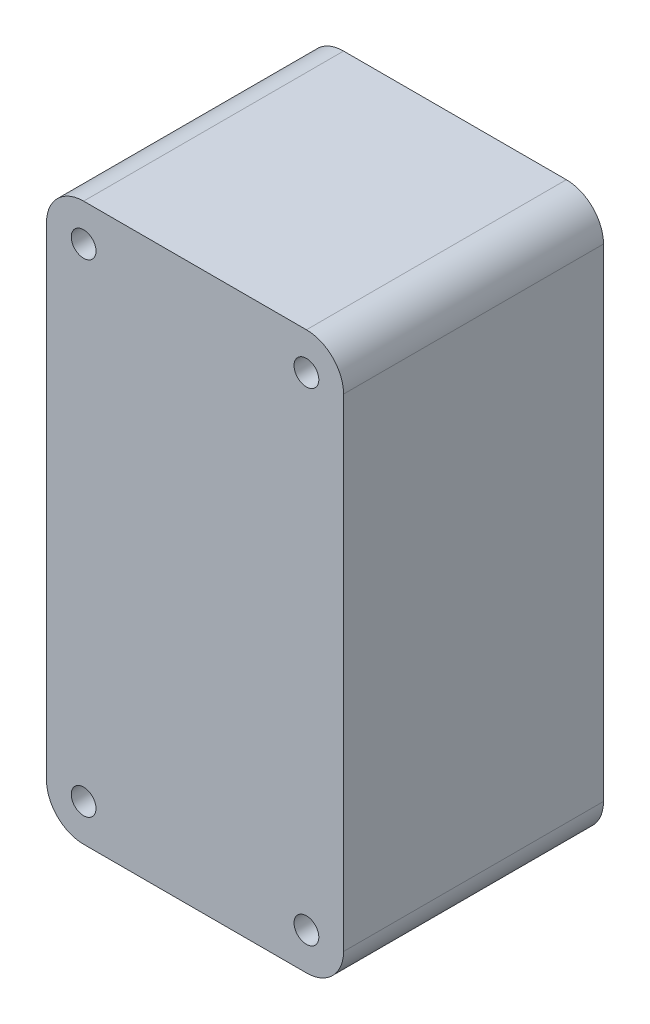
ISO-10303-21;
HEADER;
FILE_DESCRIPTION(('STEP AP214'),'2;1');
FILE_NAME('part.step','',(''),(''),'','','');
FILE_SCHEMA(('AUTOMOTIVE_DESIGN { 1 0 10303 214 1 1 1 1 }'));
ENDSEC;
DATA;
#1=APPLICATION_CONTEXT('core data for automotive mechanical design processes');
#2=APPLICATION_PROTOCOL_DEFINITION('international standard','automotive_design',2000,#1);
#3=PRODUCT_CONTEXT('',#1,'mechanical');
#4=PRODUCT('Part','Part','',(#3));
#5=PRODUCT_RELATED_PRODUCT_CATEGORY('part','',(#4));
#6=PRODUCT_DEFINITION_FORMATION('','',#4);
#7=PRODUCT_DEFINITION_CONTEXT('part definition',#1,'design');
#8=PRODUCT_DEFINITION('design','',#6,#7);
#9=PRODUCT_DEFINITION_SHAPE('','',#8);
#10=(LENGTH_UNIT() NAMED_UNIT(*) SI_UNIT(.MILLI.,.METRE.));
#11=(NAMED_UNIT(*) PLANE_ANGLE_UNIT() SI_UNIT($,.RADIAN.));
#12=(NAMED_UNIT(*) SI_UNIT($,.STERADIAN.) SOLID_ANGLE_UNIT());
#13=UNCERTAINTY_MEASURE_WITH_UNIT(LENGTH_MEASURE(1.E-05),#10,'distance_accuracy_value','');
#14=(GEOMETRIC_REPRESENTATION_CONTEXT(3) GLOBAL_UNCERTAINTY_ASSIGNED_CONTEXT((#13)) GLOBAL_UNIT_ASSIGNED_CONTEXT((#10,
#11,#12)) REPRESENTATION_CONTEXT('',''));
#15=CARTESIAN_POINT('',(0.,0.,0.));
#16=DIRECTION('',(0.,0.,1.));
#17=DIRECTION('',(1.,0.,0.));
#18=AXIS2_PLACEMENT_3D('',#15,#16,#17);
#19=CARTESIAN_POINT('',(-28.4193325347725,1.99595202398802,21.));
#20=DIRECTION('',(0.,0.,-1.));
#21=DIRECTION('',(-1.,0.,0.));
#22=AXIS2_PLACEMENT_3D('',#19,#20,#21);
#23=CYLINDRICAL_SURFACE('',#22,3.);
#24=CARTESIAN_POINT('',(-28.4193325347725,1.99595202398802,0.));
#25=DIRECTION('',(0.,0.,1.));
#26=DIRECTION('',(1.,0.,0.));
#27=AXIS2_PLACEMENT_3D('',#24,#25,#26);
#28=CIRCLE('',#27,3.);
#29=CARTESIAN_POINT('',(-28.4193325347725,4.99595202398802,0.));
#30=VERTEX_POINT('',#29);
#31=CARTESIAN_POINT('',(-31.4193325347725,1.995952023988,0.));
#32=VERTEX_POINT('',#31);
#33=EDGE_CURVE('E129',#30,#32,#28,.T.);
#34=ORIENTED_EDGE('',*,*,#33,.T.);
#35=DIRECTION('',(0.,0.,-1.));
#36=VECTOR('',#35,1.);
#37=CARTESIAN_POINT('',(-31.4193325347725,1.995952023988,21.));
#38=LINE('',#37,#36);
#39=CARTESIAN_POINT('',(-31.4193325347725,1.995952023988,21.));
#40=VERTEX_POINT('',#39);
#41=EDGE_CURVE('E11',#40,#32,#38,.T.);
#42=ORIENTED_EDGE('',*,*,#41,.F.);
#43=CARTESIAN_POINT('',(-28.4193325347725,1.99595202398802,21.));
#44=DIRECTION('',(0.,0.,1.));
#45=DIRECTION('',(1.,0.,0.));
#46=AXIS2_PLACEMENT_3D('',#43,#44,#45);
#47=CIRCLE('',#46,3.);
#48=CARTESIAN_POINT('',(-28.4193325347725,4.99595202398802,21.));
#49=VERTEX_POINT('',#48);
#50=EDGE_CURVE('E144',#49,#40,#47,.T.);
#51=ORIENTED_EDGE('',*,*,#50,.F.);
#52=DIRECTION('',(0.,0.,-1.));
#53=VECTOR('',#52,1.);
#54=CARTESIAN_POINT('',(-28.4193325347725,4.99595202398802,21.));
#55=LINE('',#54,#53);
#56=EDGE_CURVE('E125',#49,#30,#55,.T.);
#57=ORIENTED_EDGE('',*,*,#56,.T.);
#58=EDGE_LOOP('',(#34,#42,#51,#57));
#59=FACE_BOUND('',#58,.T.);
#60=ADVANCED_FACE('F33',(#59),#23,.T.);
#61=CARTESIAN_POINT('',(-31.4193325347725,1.995952023988,21.));
#62=DIRECTION('',(1.,0.,0.));
#63=DIRECTION('',(0.,1.,0.));
#64=AXIS2_PLACEMENT_3D('',#61,#62,#63);
#65=PLANE('',#64);
#66=DIRECTION('',(0.,-1.,0.));
#67=VECTOR('',#66,1.);
#68=CARTESIAN_POINT('',(-31.4193325347725,1.995952023988,0.));
#69=LINE('',#68,#67);
#70=CARTESIAN_POINT('',(-31.4193325347725,-37.004047976012,0.));
#71=VERTEX_POINT('',#70);
#72=EDGE_CURVE('E132',#32,#71,#69,.T.);
#73=ORIENTED_EDGE('',*,*,#72,.T.);
#74=DIRECTION('',(0.,0.,-1.));
#75=VECTOR('',#74,1.);
#76=CARTESIAN_POINT('',(-31.4193325347725,-37.004047976012,21.));
#77=LINE('',#76,#75);
#78=CARTESIAN_POINT('',(-31.4193325347725,-37.004047976012,21.));
#79=VERTEX_POINT('',#78);
#80=EDGE_CURVE('E41',#79,#71,#77,.T.);
#81=ORIENTED_EDGE('',*,*,#80,.F.);
#82=DIRECTION('',(0.,-1.,0.));
#83=VECTOR('',#82,1.);
#84=CARTESIAN_POINT('',(-31.4193325347725,1.995952023988,21.));
#85=LINE('',#84,#83);
#86=EDGE_CURVE('E92',#40,#79,#85,.T.);
#87=ORIENTED_EDGE('',*,*,#86,.F.);
#88=ORIENTED_EDGE('',*,*,#41,.T.);
#89=EDGE_LOOP('',(#73,#81,#87,#88));
#90=FACE_BOUND('',#89,.T.);
#91=ADVANCED_FACE('F235',(#90),#65,.F.);
#92=CARTESIAN_POINT('',(-28.4193325347725,-37.004047976012,21.));
#93=DIRECTION('',(0.,0.,-1.));
#94=DIRECTION('',(-1.,0.,0.));
#95=AXIS2_PLACEMENT_3D('',#92,#93,#94);
#96=CYLINDRICAL_SURFACE('',#95,3.);
#97=CARTESIAN_POINT('',(-28.4193325347725,-37.004047976012,0.));
#98=DIRECTION('',(0.,0.,1.));
#99=DIRECTION('',(1.,0.,0.));
#100=AXIS2_PLACEMENT_3D('',#97,#98,#99);
#101=CIRCLE('',#100,3.);
#102=CARTESIAN_POINT('',(-28.4193325347725,-40.004047976012,0.));
#103=VERTEX_POINT('',#102);
#104=EDGE_CURVE('E135',#71,#103,#101,.T.);
#105=ORIENTED_EDGE('',*,*,#104,.T.);
#106=DIRECTION('',(0.,0.,-1.));
#107=VECTOR('',#106,1.);
#108=CARTESIAN_POINT('',(-28.4193325347725,-40.004047976012,21.));
#109=LINE('',#108,#107);
#110=CARTESIAN_POINT('',(-28.4193325347725,-40.004047976012,21.));
#111=VERTEX_POINT('',#110);
#112=EDGE_CURVE('E151',#111,#103,#109,.T.);
#113=ORIENTED_EDGE('',*,*,#112,.F.);
#114=CARTESIAN_POINT('',(-28.4193325347725,-37.004047976012,21.));
#115=DIRECTION('',(0.,0.,1.));
#116=DIRECTION('',(1.,0.,0.));
#117=AXIS2_PLACEMENT_3D('',#114,#115,#116);
#118=CIRCLE('',#117,3.);
#119=EDGE_CURVE('E159',#79,#111,#118,.T.);
#120=ORIENTED_EDGE('',*,*,#119,.F.);
#121=ORIENTED_EDGE('',*,*,#80,.T.);
#122=EDGE_LOOP('',(#105,#113,#120,#121));
#123=FACE_BOUND('',#122,.T.);
#124=ADVANCED_FACE('F157',(#123),#96,.T.);
#125=CARTESIAN_POINT('',(-28.4193325347725,-40.004047976012,21.));
#126=DIRECTION('',(0.,1.,0.));
#127=DIRECTION('',(0.,0.,1.));
#128=AXIS2_PLACEMENT_3D('',#125,#126,#127);
#129=PLANE('',#128);
#130=DIRECTION('',(1.,0.,0.));
#131=VECTOR('',#130,1.);
#132=CARTESIAN_POINT('',(-28.4193325347725,-40.004047976012,0.));
#133=LINE('',#132,#131);
#134=CARTESIAN_POINT('',(-10.4193325347725,-40.004047976012,0.));
#135=VERTEX_POINT('',#134);
#136=EDGE_CURVE('E137',#103,#135,#133,.T.);
#137=ORIENTED_EDGE('',*,*,#136,.T.);
#138=DIRECTION('',(0.,0.,-1.));
#139=VECTOR('',#138,1.);
#140=CARTESIAN_POINT('',(-10.4193325347725,-40.004047976012,21.));
#141=LINE('',#140,#139);
#142=CARTESIAN_POINT('',(-10.4193325347725,-40.004047976012,21.));
#143=VERTEX_POINT('',#142);
#144=EDGE_CURVE('E148',#143,#135,#141,.T.);
#145=ORIENTED_EDGE('',*,*,#144,.F.);
#146=DIRECTION('',(1.,0.,0.));
#147=VECTOR('',#146,1.);
#148=CARTESIAN_POINT('',(-28.4193325347725,-40.004047976012,21.));
#149=LINE('',#148,#147);
#150=EDGE_CURVE('E171',#111,#143,#149,.T.);
#151=ORIENTED_EDGE('',*,*,#150,.F.);
#152=ORIENTED_EDGE('',*,*,#112,.T.);
#153=EDGE_LOOP('',(#137,#145,#151,#152));
#154=FACE_BOUND('',#153,.T.);
#155=ADVANCED_FACE('F167',(#154),#129,.F.);
#156=CARTESIAN_POINT('',(-10.4193325347725,-37.004047976012,21.));
#157=DIRECTION('',(0.,0.,-1.));
#158=DIRECTION('',(-1.,0.,0.));
#159=AXIS2_PLACEMENT_3D('',#156,#157,#158);
#160=CYLINDRICAL_SURFACE('',#159,3.);
#161=CARTESIAN_POINT('',(-10.4193325347725,-37.004047976012,0.));
#162=DIRECTION('',(0.,0.,1.));
#163=DIRECTION('',(-1.,0.,0.));
#164=AXIS2_PLACEMENT_3D('',#161,#162,#163);
#165=CIRCLE('',#164,3.);
#166=CARTESIAN_POINT('',(-7.41933253477248,-37.004047976012,0.));
#167=VERTEX_POINT('',#166);
#168=EDGE_CURVE('E139',#135,#167,#165,.T.);
#169=ORIENTED_EDGE('',*,*,#168,.T.);
#170=DIRECTION('',(0.,0.,-1.));
#171=VECTOR('',#170,1.);
#172=CARTESIAN_POINT('',(-7.41933253477248,-37.004047976012,21.));
#173=LINE('',#172,#171);
#174=CARTESIAN_POINT('',(-7.41933253477248,-37.004047976012,21.));
#175=VERTEX_POINT('',#174);
#176=EDGE_CURVE('E120',#175,#167,#173,.T.);
#177=ORIENTED_EDGE('',*,*,#176,.F.);
#178=CARTESIAN_POINT('',(-10.4193325347725,-37.004047976012,21.));
#179=DIRECTION('',(0.,0.,1.));
#180=DIRECTION('',(-1.,0.,0.));
#181=AXIS2_PLACEMENT_3D('',#178,#179,#180);
#182=CIRCLE('',#181,3.);
#183=EDGE_CURVE('E111',#143,#175,#182,.T.);
#184=ORIENTED_EDGE('',*,*,#183,.F.);
#185=ORIENTED_EDGE('',*,*,#144,.T.);
#186=EDGE_LOOP('',(#169,#177,#184,#185));
#187=FACE_BOUND('',#186,.T.);
#188=ADVANCED_FACE('F170',(#187),#160,.T.);
#189=CARTESIAN_POINT('',(-7.41933253477248,1.995952023988,21.));
#190=DIRECTION('',(-1.,0.,0.));
#191=DIRECTION('',(0.,-1.,0.));
#192=AXIS2_PLACEMENT_3D('',#189,#190,#191);
#193=PLANE('',#192);
#194=DIRECTION('',(0.,1.,0.));
#195=VECTOR('',#194,1.);
#196=CARTESIAN_POINT('',(-7.41933253477248,1.995952023988,0.));
#197=LINE('',#196,#195);
#198=CARTESIAN_POINT('',(-7.41933253477248,1.995952023988,0.));
#199=VERTEX_POINT('',#198);
#200=EDGE_CURVE('E119',#167,#199,#197,.T.);
#201=ORIENTED_EDGE('',*,*,#200,.T.);
#202=DIRECTION('',(0.,0.,-1.));
#203=VECTOR('',#202,1.);
#204=CARTESIAN_POINT('',(-7.41933253477248,1.995952023988,21.));
#205=LINE('',#204,#203);
#206=CARTESIAN_POINT('',(-7.41933253477248,1.995952023988,21.));
#207=VERTEX_POINT('',#206);
#208=EDGE_CURVE('E116',#207,#199,#205,.T.);
#209=ORIENTED_EDGE('',*,*,#208,.F.);
#210=DIRECTION('',(0.,1.,0.));
#211=VECTOR('',#210,1.);
#212=CARTESIAN_POINT('',(-7.41933253477248,1.995952023988,21.));
#213=LINE('',#212,#211);
#214=EDGE_CURVE('E105',#175,#207,#213,.T.);
#215=ORIENTED_EDGE('',*,*,#214,.F.);
#216=ORIENTED_EDGE('',*,*,#176,.T.);
#217=EDGE_LOOP('',(#201,#209,#215,#216));
#218=FACE_BOUND('',#217,.T.);
#219=ADVANCED_FACE('F117',(#218),#193,.F.);
#220=CARTESIAN_POINT('',(-10.4193325347725,1.99595202398802,21.));
#221=DIRECTION('',(0.,0.,-1.));
#222=DIRECTION('',(-1.,0.,0.));
#223=AXIS2_PLACEMENT_3D('',#220,#221,#222);
#224=CYLINDRICAL_SURFACE('',#223,3.);
#225=CARTESIAN_POINT('',(-10.4193325347725,1.99595202398802,0.));
#226=DIRECTION('',(0.,0.,1.));
#227=DIRECTION('',(1.,0.,0.));
#228=AXIS2_PLACEMENT_3D('',#225,#226,#227);
#229=CIRCLE('',#228,3.);
#230=CARTESIAN_POINT('',(-10.4193325347725,4.99595202398802,0.));
#231=VERTEX_POINT('',#230);
#232=EDGE_CURVE('E78',#199,#231,#229,.T.);
#233=ORIENTED_EDGE('',*,*,#232,.T.);
#234=DIRECTION('',(0.,0.,-1.));
#235=VECTOR('',#234,1.);
#236=CARTESIAN_POINT('',(-10.4193325347725,4.99595202398802,21.));
#237=LINE('',#236,#235);
#238=CARTESIAN_POINT('',(-10.4193325347725,4.99595202398802,21.));
#239=VERTEX_POINT('',#238);
#240=EDGE_CURVE('E121',#239,#231,#237,.T.);
#241=ORIENTED_EDGE('',*,*,#240,.F.);
#242=CARTESIAN_POINT('',(-10.4193325347725,1.99595202398802,21.));
#243=DIRECTION('',(0.,0.,1.));
#244=DIRECTION('',(1.,0.,0.));
#245=AXIS2_PLACEMENT_3D('',#242,#243,#244);
#246=CIRCLE('',#245,3.);
#247=EDGE_CURVE('E109',#207,#239,#246,.T.);
#248=ORIENTED_EDGE('',*,*,#247,.F.);
#249=ORIENTED_EDGE('',*,*,#208,.T.);
#250=EDGE_LOOP('',(#233,#241,#248,#249));
#251=FACE_BOUND('',#250,.T.);
#252=ADVANCED_FACE('F123',(#251),#224,.T.);
#253=CARTESIAN_POINT('',(-28.4193325347725,4.99595202398802,21.));
#254=DIRECTION('',(0.,-1.,0.));
#255=DIRECTION('',(0.,0.,-1.));
#256=AXIS2_PLACEMENT_3D('',#253,#254,#255);
#257=PLANE('',#256);
#258=DIRECTION('',(-1.,0.,0.));
#259=VECTOR('',#258,1.);
#260=CARTESIAN_POINT('',(-28.4193325347725,4.99595202398802,0.));
#261=LINE('',#260,#259);
#262=EDGE_CURVE('E84',#231,#30,#261,.T.);
#263=ORIENTED_EDGE('',*,*,#262,.T.);
#264=ORIENTED_EDGE('',*,*,#56,.F.);
#265=DIRECTION('',(-1.,0.,0.));
#266=VECTOR('',#265,1.);
#267=CARTESIAN_POINT('',(-28.4193325347725,4.99595202398802,21.));
#268=LINE('',#267,#266);
#269=EDGE_CURVE('E49',#239,#49,#268,.T.);
#270=ORIENTED_EDGE('',*,*,#269,.F.);
#271=ORIENTED_EDGE('',*,*,#240,.T.);
#272=EDGE_LOOP('',(#263,#264,#270,#271));
#273=FACE_BOUND('',#272,.T.);
#274=ADVANCED_FACE('F212',(#273),#257,.F.);
#275=CARTESIAN_POINT('',(-28.4193325347725,1.99595202398802,21.));
#276=DIRECTION('',(0.,0.,1.));
#277=DIRECTION('',(1.,0.,0.));
#278=AXIS2_PLACEMENT_3D('',#275,#276,#277);
#279=PLANE('',#278);
#280=CARTESIAN_POINT('',(-10.4193325347725,1.99595202398802,21.));
#281=DIRECTION('',(0.,0.,1.));
#282=DIRECTION('',(1.,0.,0.));
#283=AXIS2_PLACEMENT_3D('',#280,#281,#282);
#284=CIRCLE('',#283,1.);
#285=CARTESIAN_POINT('',(-9.41933253477248,1.99595202398802,21.));
#286=VERTEX_POINT('',#285);
#287=EDGE_CURVE('E195',#286,#286,#284,.T.);
#288=ORIENTED_EDGE('',*,*,#287,.F.);
#289=EDGE_LOOP('',(#288));
#290=FACE_BOUND('',#289,.T.);
#291=CARTESIAN_POINT('',(-28.4193325347725,1.99595202398802,21.));
#292=DIRECTION('',(0.,0.,1.));
#293=DIRECTION('',(1.,0.,0.));
#294=AXIS2_PLACEMENT_3D('',#291,#292,#293);
#295=CIRCLE('',#294,1.);
#296=CARTESIAN_POINT('',(-27.4193325347725,1.99595202398802,21.));
#297=VERTEX_POINT('',#296);
#298=EDGE_CURVE('E189',#297,#297,#295,.T.);
#299=ORIENTED_EDGE('',*,*,#298,.F.);
#300=EDGE_LOOP('',(#299));
#301=FACE_BOUND('',#300,.T.);
#302=CARTESIAN_POINT('',(-10.4193325347725,-37.004047976012,21.));
#303=DIRECTION('',(0.,0.,1.));
#304=DIRECTION('',(1.,0.,0.));
#305=AXIS2_PLACEMENT_3D('',#302,#303,#304);
#306=CIRCLE('',#305,1.);
#307=CARTESIAN_POINT('',(-9.41933253477248,-37.004047976012,21.));
#308=VERTEX_POINT('',#307);
#309=EDGE_CURVE('E183',#308,#308,#306,.T.);
#310=ORIENTED_EDGE('',*,*,#309,.F.);
#311=EDGE_LOOP('',(#310));
#312=FACE_BOUND('',#311,.T.);
#313=CARTESIAN_POINT('',(-28.4193325347725,-37.004047976012,21.));
#314=DIRECTION('',(0.,0.,1.));
#315=DIRECTION('',(1.,0.,0.));
#316=AXIS2_PLACEMENT_3D('',#313,#314,#315);
#317=CIRCLE('',#316,1.);
#318=CARTESIAN_POINT('',(-27.4193325347725,-37.004047976012,21.));
#319=VERTEX_POINT('',#318);
#320=EDGE_CURVE('E177',#319,#319,#317,.T.);
#321=ORIENTED_EDGE('',*,*,#320,.F.);
#322=EDGE_LOOP('',(#321));
#323=FACE_BOUND('',#322,.T.);
#324=ORIENTED_EDGE('',*,*,#50,.T.);
#325=ORIENTED_EDGE('',*,*,#86,.T.);
#326=ORIENTED_EDGE('',*,*,#119,.T.);
#327=ORIENTED_EDGE('',*,*,#150,.T.);
#328=ORIENTED_EDGE('',*,*,#183,.T.);
#329=ORIENTED_EDGE('',*,*,#214,.T.);
#330=ORIENTED_EDGE('',*,*,#247,.T.);
#331=ORIENTED_EDGE('',*,*,#269,.T.);
#332=EDGE_LOOP('',(#324,#325,#326,#327,#328,#329,#330,#331));
#333=FACE_BOUND('',#332,.T.);
#334=ADVANCED_FACE('F107',(#290,#301,#312,#323,#333),#279,.T.);
#335=CARTESIAN_POINT('',(-28.4193325347725,1.99595202398802,0.));
#336=DIRECTION('',(0.,0.,1.));
#337=DIRECTION('',(1.,0.,0.));
#338=AXIS2_PLACEMENT_3D('',#335,#336,#337);
#339=PLANE('',#338);
#340=ORIENTED_EDGE('',*,*,#33,.F.);
#341=ORIENTED_EDGE('',*,*,#262,.F.);
#342=ORIENTED_EDGE('',*,*,#232,.F.);
#343=ORIENTED_EDGE('',*,*,#200,.F.);
#344=ORIENTED_EDGE('',*,*,#168,.F.);
#345=ORIENTED_EDGE('',*,*,#136,.F.);
#346=ORIENTED_EDGE('',*,*,#104,.F.);
#347=ORIENTED_EDGE('',*,*,#72,.F.);
#348=EDGE_LOOP('',(#340,#341,#342,#343,#344,#345,#346,#347));
#349=FACE_BOUND('',#348,.T.);
#350=ADVANCED_FACE('F163',(#349),#339,.F.);
#351=CARTESIAN_POINT('',(-28.4193325347725,-37.004047976012,17.));
#352=DIRECTION('',(0.,0.,1.));
#353=DIRECTION('',(1.,0.,0.));
#354=AXIS2_PLACEMENT_3D('',#351,#352,#353);
#355=CYLINDRICAL_SURFACE('',#354,1.);
#356=CARTESIAN_POINT('',(-28.4193325347725,-37.004047976012,17.));
#357=DIRECTION('',(0.,0.,1.));
#358=DIRECTION('',(1.,0.,0.));
#359=AXIS2_PLACEMENT_3D('',#356,#357,#358);
#360=CIRCLE('',#359,1.);
#361=CARTESIAN_POINT('',(-27.4193325347725,-37.004047976012,17.));
#362=VERTEX_POINT('',#361);
#363=EDGE_CURVE('E133',#362,#362,#360,.T.);
#364=ORIENTED_EDGE('',*,*,#363,.F.);
#365=EDGE_LOOP('',(#364));
#366=FACE_BOUND('',#365,.T.);
#367=ORIENTED_EDGE('',*,*,#320,.T.);
#368=EDGE_LOOP('',(#367));
#369=FACE_BOUND('',#368,.T.);
#370=ADVANCED_FACE('F220',(#366,#369),#355,.F.);
#371=CARTESIAN_POINT('',(-28.4193325347725,-37.004047976012,17.));
#372=DIRECTION('',(0.,0.,1.));
#373=DIRECTION('',(1.,0.,0.));
#374=AXIS2_PLACEMENT_3D('',#371,#372,#373);
#375=PLANE('',#374);
#376=ORIENTED_EDGE('',*,*,#363,.T.);
#377=EDGE_LOOP('',(#376));
#378=FACE_BOUND('',#377,.T.);
#379=ADVANCED_FACE('F222',(#378),#375,.T.);
#380=CARTESIAN_POINT('',(-10.4193325347725,-37.004047976012,17.));
#381=DIRECTION('',(0.,0.,1.));
#382=DIRECTION('',(1.,0.,0.));
#383=AXIS2_PLACEMENT_3D('',#380,#381,#382);
#384=CYLINDRICAL_SURFACE('',#383,1.);
#385=CARTESIAN_POINT('',(-10.4193325347725,-37.004047976012,17.));
#386=DIRECTION('',(0.,0.,1.));
#387=DIRECTION('',(1.,0.,0.));
#388=AXIS2_PLACEMENT_3D('',#385,#386,#387);
#389=CIRCLE('',#388,1.);
#390=CARTESIAN_POINT('',(-9.41933253477248,-37.004047976012,17.));
#391=VERTEX_POINT('',#390);
#392=EDGE_CURVE('E180',#391,#391,#389,.T.);
#393=ORIENTED_EDGE('',*,*,#392,.F.);
#394=EDGE_LOOP('',(#393));
#395=FACE_BOUND('',#394,.T.);
#396=ORIENTED_EDGE('',*,*,#309,.T.);
#397=EDGE_LOOP('',(#396));
#398=FACE_BOUND('',#397,.T.);
#399=ADVANCED_FACE('F229',(#395,#398),#384,.F.);
#400=CARTESIAN_POINT('',(-10.4193325347725,-37.004047976012,17.));
#401=DIRECTION('',(0.,0.,1.));
#402=DIRECTION('',(1.,0.,0.));
#403=AXIS2_PLACEMENT_3D('',#400,#401,#402);
#404=PLANE('',#403);
#405=ORIENTED_EDGE('',*,*,#392,.T.);
#406=EDGE_LOOP('',(#405));
#407=FACE_BOUND('',#406,.T.);
#408=ADVANCED_FACE('F306',(#407),#404,.T.);
#409=CARTESIAN_POINT('',(-28.4193325347725,1.99595202398802,17.));
#410=DIRECTION('',(0.,0.,1.));
#411=DIRECTION('',(1.,0.,0.));
#412=AXIS2_PLACEMENT_3D('',#409,#410,#411);
#413=CYLINDRICAL_SURFACE('',#412,1.);
#414=CARTESIAN_POINT('',(-28.4193325347725,1.99595202398802,17.));
#415=DIRECTION('',(0.,0.,1.));
#416=DIRECTION('',(1.,0.,0.));
#417=AXIS2_PLACEMENT_3D('',#414,#415,#416);
#418=CIRCLE('',#417,1.);
#419=CARTESIAN_POINT('',(-27.4193325347725,1.99595202398802,17.));
#420=VERTEX_POINT('',#419);
#421=EDGE_CURVE('E186',#420,#420,#418,.T.);
#422=ORIENTED_EDGE('',*,*,#421,.F.);
#423=EDGE_LOOP('',(#422));
#424=FACE_BOUND('',#423,.T.);
#425=ORIENTED_EDGE('',*,*,#298,.T.);
#426=EDGE_LOOP('',(#425));
#427=FACE_BOUND('',#426,.T.);
#428=ADVANCED_FACE('F316',(#424,#427),#413,.F.);
#429=CARTESIAN_POINT('',(-28.4193325347725,1.99595202398802,17.));
#430=DIRECTION('',(0.,0.,1.));
#431=DIRECTION('',(1.,0.,0.));
#432=AXIS2_PLACEMENT_3D('',#429,#430,#431);
#433=PLANE('',#432);
#434=ORIENTED_EDGE('',*,*,#421,.T.);
#435=EDGE_LOOP('',(#434));
#436=FACE_BOUND('',#435,.T.);
#437=ADVANCED_FACE('F206',(#436),#433,.T.);
#438=CARTESIAN_POINT('',(-10.4193325347725,1.99595202398802,17.));
#439=DIRECTION('',(0.,0.,1.));
#440=DIRECTION('',(1.,0.,0.));
#441=AXIS2_PLACEMENT_3D('',#438,#439,#440);
#442=CYLINDRICAL_SURFACE('',#441,1.);
#443=CARTESIAN_POINT('',(-10.4193325347725,1.99595202398802,17.));
#444=DIRECTION('',(0.,0.,1.));
#445=DIRECTION('',(1.,0.,0.));
#446=AXIS2_PLACEMENT_3D('',#443,#444,#445);
#447=CIRCLE('',#446,1.);
#448=CARTESIAN_POINT('',(-9.41933253477248,1.99595202398802,17.));
#449=VERTEX_POINT('',#448);
#450=EDGE_CURVE('E192',#449,#449,#447,.T.);
#451=ORIENTED_EDGE('',*,*,#450,.F.);
#452=EDGE_LOOP('',(#451));
#453=FACE_BOUND('',#452,.T.);
#454=ORIENTED_EDGE('',*,*,#287,.T.);
#455=EDGE_LOOP('',(#454));
#456=FACE_BOUND('',#455,.T.);
#457=ADVANCED_FACE('F203',(#453,#456),#442,.F.);
#458=CARTESIAN_POINT('',(-10.4193325347725,1.99595202398802,17.));
#459=DIRECTION('',(0.,0.,1.));
#460=DIRECTION('',(1.,0.,0.));
#461=AXIS2_PLACEMENT_3D('',#458,#459,#460);
#462=PLANE('',#461);
#463=ORIENTED_EDGE('',*,*,#450,.T.);
#464=EDGE_LOOP('',(#463));
#465=FACE_BOUND('',#464,.T.);
#466=ADVANCED_FACE('F201',(#465),#462,.T.);
#467=CLOSED_SHELL('',(#60,#91,#124,#155,#188,#219,#252,#274,#334,#350,#370,#379,#399,#408,#428,
#437,#457,#466));
#468=MANIFOLD_SOLID_BREP('B2',#467);
#469=ADVANCED_BREP_SHAPE_REPRESENTATION('',(#18,#468),#14);
#470=SHAPE_DEFINITION_REPRESENTATION(#9,#469);
ENDSEC;
END-ISO-10303-21;
